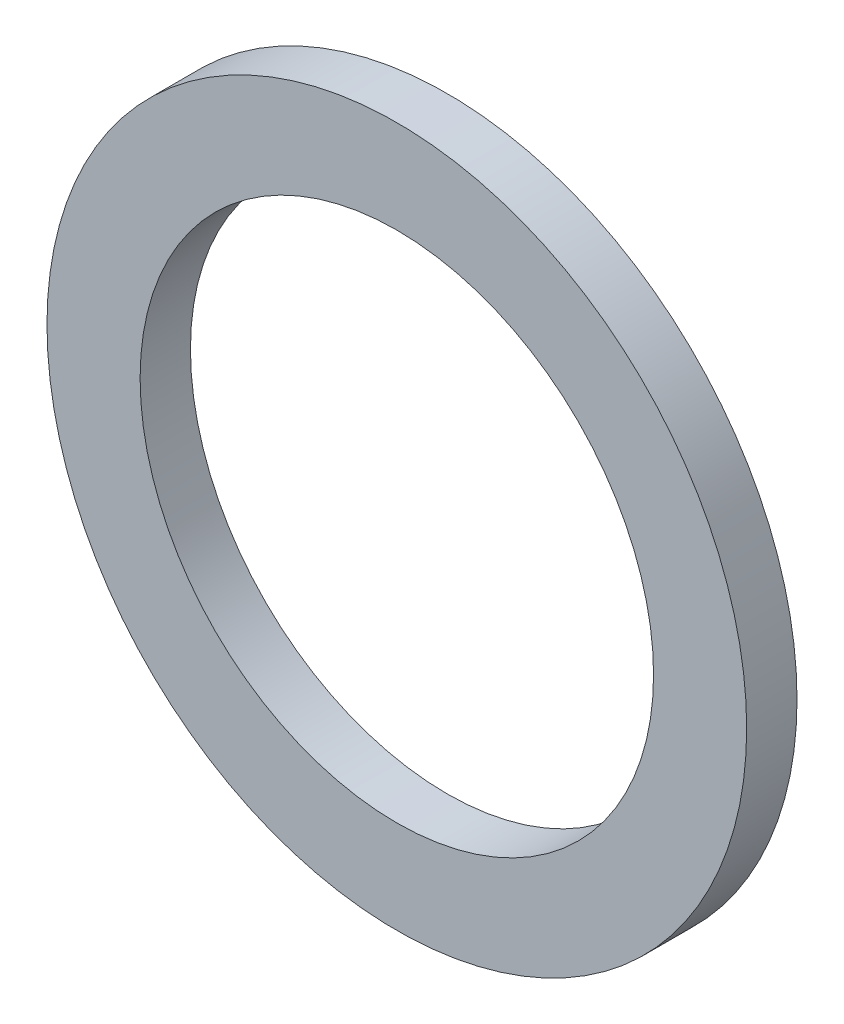
ISO-10303-21;
HEADER;
FILE_DESCRIPTION(('STEP AP214'),'2;1');
FILE_NAME('part.step','',(''),(''),'','','');
FILE_SCHEMA(('AUTOMOTIVE_DESIGN { 1 0 10303 214 1 1 1 1 }'));
ENDSEC;
DATA;
#1=APPLICATION_CONTEXT('core data for automotive mechanical design processes');
#2=APPLICATION_PROTOCOL_DEFINITION('international standard','automotive_design',2000,#1);
#3=PRODUCT_CONTEXT('',#1,'mechanical');
#4=PRODUCT('Part','Part','',(#3));
#5=PRODUCT_RELATED_PRODUCT_CATEGORY('part','',(#4));
#6=PRODUCT_DEFINITION_FORMATION('','',#4);
#7=PRODUCT_DEFINITION_CONTEXT('part definition',#1,'design');
#8=PRODUCT_DEFINITION('design','',#6,#7);
#9=PRODUCT_DEFINITION_SHAPE('','',#8);
#10=(LENGTH_UNIT() NAMED_UNIT(*) SI_UNIT(.MILLI.,.METRE.));
#11=(NAMED_UNIT(*) PLANE_ANGLE_UNIT() SI_UNIT($,.RADIAN.));
#12=(NAMED_UNIT(*) SI_UNIT($,.STERADIAN.) SOLID_ANGLE_UNIT());
#13=UNCERTAINTY_MEASURE_WITH_UNIT(LENGTH_MEASURE(1.E-05),#10,'distance_accuracy_value','');
#14=(GEOMETRIC_REPRESENTATION_CONTEXT(3) GLOBAL_UNCERTAINTY_ASSIGNED_CONTEXT((#13)) GLOBAL_UNIT_ASSIGNED_CONTEXT((#10,
#11,#12)) REPRESENTATION_CONTEXT('',''));
#15=CARTESIAN_POINT('',(0.,0.,0.));
#16=DIRECTION('',(0.,0.,1.));
#17=DIRECTION('',(1.,0.,0.));
#18=AXIS2_PLACEMENT_3D('',#15,#16,#17);
#19=CARTESIAN_POINT('',(0.,0.,0.5));
#20=DIRECTION('',(0.,0.,1.));
#21=DIRECTION('',(1.,0.,0.));
#22=AXIS2_PLACEMENT_3D('',#19,#20,#21);
#23=PLANE('',#22);
#24=CARTESIAN_POINT('',(0.,0.,0.5));
#25=DIRECTION('',(0.,0.,1.));
#26=DIRECTION('',(1.,0.,0.));
#27=AXIS2_PLACEMENT_3D('',#24,#25,#26);
#28=CIRCLE('',#27,6.95);
#29=CARTESIAN_POINT('',(6.95,0.,0.5));
#30=VERTEX_POINT('',#29);
#31=EDGE_CURVE('E10',#30,#30,#28,.T.);
#32=ORIENTED_EDGE('',*,*,#31,.T.);
#33=EDGE_LOOP('',(#32));
#34=FACE_BOUND('',#33,.T.);
#35=CARTESIAN_POINT('',(0.,0.,0.5));
#36=DIRECTION('',(0.,0.,1.));
#37=DIRECTION('',(1.,0.,0.));
#38=AXIS2_PLACEMENT_3D('',#35,#36,#37);
#39=CIRCLE('',#38,5.1);
#40=CARTESIAN_POINT('',(5.1,0.,0.5));
#41=VERTEX_POINT('',#40);
#42=EDGE_CURVE('E46',#41,#41,#39,.T.);
#43=ORIENTED_EDGE('',*,*,#42,.F.);
#44=EDGE_LOOP('',(#43));
#45=FACE_BOUND('',#44,.T.);
#46=ADVANCED_FACE('F35',(#34,#45),#23,.T.);
#47=CARTESIAN_POINT('',(0.,0.,-0.5));
#48=DIRECTION('',(0.,0.,1.));
#49=DIRECTION('',(1.,0.,0.));
#50=AXIS2_PLACEMENT_3D('',#47,#48,#49);
#51=PLANE('',#50);
#52=CARTESIAN_POINT('',(0.,0.,-0.5));
#53=DIRECTION('',(0.,0.,1.));
#54=DIRECTION('',(1.,0.,0.));
#55=AXIS2_PLACEMENT_3D('',#52,#53,#54);
#56=CIRCLE('',#55,6.95);
#57=CARTESIAN_POINT('',(6.95,0.,-0.5));
#58=VERTEX_POINT('',#57);
#59=EDGE_CURVE('E39',#58,#58,#56,.T.);
#60=ORIENTED_EDGE('',*,*,#59,.F.);
#61=EDGE_LOOP('',(#60));
#62=FACE_BOUND('',#61,.T.);
#63=CARTESIAN_POINT('',(0.,0.,-0.5));
#64=DIRECTION('',(0.,0.,1.));
#65=DIRECTION('',(1.,0.,0.));
#66=AXIS2_PLACEMENT_3D('',#63,#64,#65);
#67=CIRCLE('',#66,5.1);
#68=CARTESIAN_POINT('',(5.1,0.,-0.5));
#69=VERTEX_POINT('',#68);
#70=EDGE_CURVE('E48',#69,#69,#67,.T.);
#71=ORIENTED_EDGE('',*,*,#70,.T.);
#72=EDGE_LOOP('',(#71));
#73=FACE_BOUND('',#72,.T.);
#74=ADVANCED_FACE('F58',(#62,#73),#51,.F.);
#75=CARTESIAN_POINT('',(0.,0.,0.5));
#76=DIRECTION('',(0.,0.,-1.));
#77=DIRECTION('',(-1.,0.,0.));
#78=AXIS2_PLACEMENT_3D('',#75,#76,#77);
#79=CYLINDRICAL_SURFACE('',#78,6.95);
#80=ORIENTED_EDGE('',*,*,#31,.F.);
#81=EDGE_LOOP('',(#80));
#82=FACE_BOUND('',#81,.T.);
#83=ORIENTED_EDGE('',*,*,#59,.T.);
#84=EDGE_LOOP('',(#83));
#85=FACE_BOUND('',#84,.T.);
#86=ADVANCED_FACE('F37',(#82,#85),#79,.T.);
#87=CARTESIAN_POINT('',(0.,0.,0.5));
#88=DIRECTION('',(0.,0.,-1.));
#89=DIRECTION('',(-1.,0.,0.));
#90=AXIS2_PLACEMENT_3D('',#87,#88,#89);
#91=CYLINDRICAL_SURFACE('',#90,5.1);
#92=ORIENTED_EDGE('',*,*,#42,.T.);
#93=EDGE_LOOP('',(#92));
#94=FACE_BOUND('',#93,.T.);
#95=ORIENTED_EDGE('',*,*,#70,.F.);
#96=EDGE_LOOP('',(#95));
#97=FACE_BOUND('',#96,.T.);
#98=ADVANCED_FACE('F54',(#94,#97),#91,.F.);
#99=CLOSED_SHELL('',(#46,#74,#86,#98));
#100=MANIFOLD_SOLID_BREP('B2',#99);
#101=ADVANCED_BREP_SHAPE_REPRESENTATION('',(#18,#100),#14);
#102=SHAPE_DEFINITION_REPRESENTATION(#9,#101);
ENDSEC;
END-ISO-10303-21;
